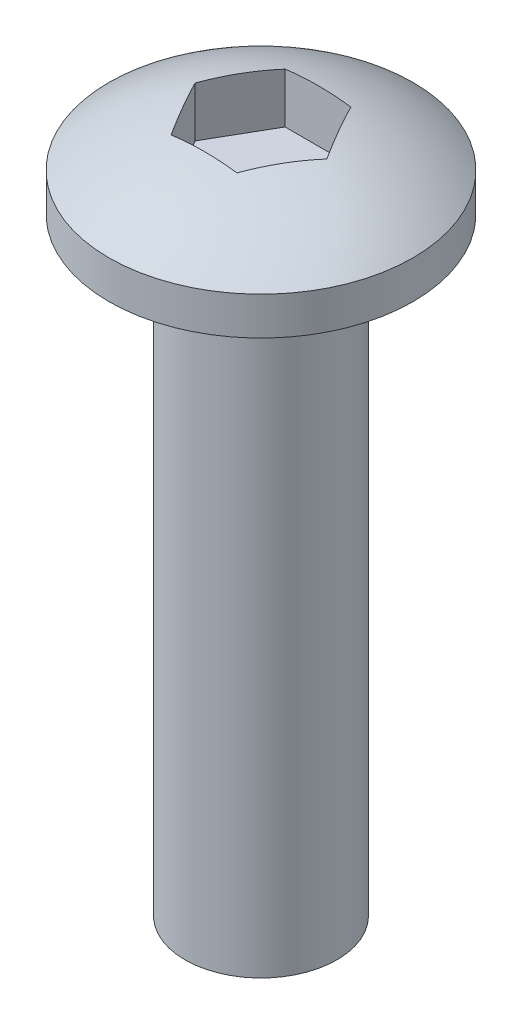
ISO-10303-21;
HEADER;
FILE_DESCRIPTION(('STEP AP214'),'2;1');
FILE_NAME('part.step','',(''),(''),'','','');
FILE_SCHEMA(('AUTOMOTIVE_DESIGN { 1 0 10303 214 1 1 1 1 }'));
ENDSEC;
DATA;
#1=APPLICATION_CONTEXT('core data for automotive mechanical design processes');
#2=APPLICATION_PROTOCOL_DEFINITION('international standard','automotive_design',2000,#1);
#3=PRODUCT_CONTEXT('',#1,'mechanical');
#4=PRODUCT('Part','Part','',(#3));
#5=PRODUCT_RELATED_PRODUCT_CATEGORY('part','',(#4));
#6=PRODUCT_DEFINITION_FORMATION('','',#4);
#7=PRODUCT_DEFINITION_CONTEXT('part definition',#1,'design');
#8=PRODUCT_DEFINITION('design','',#6,#7);
#9=PRODUCT_DEFINITION_SHAPE('','',#8);
#10=(LENGTH_UNIT() NAMED_UNIT(*) SI_UNIT(.MILLI.,.METRE.));
#11=(NAMED_UNIT(*) PLANE_ANGLE_UNIT() SI_UNIT($,.RADIAN.));
#12=(NAMED_UNIT(*) SI_UNIT($,.STERADIAN.) SOLID_ANGLE_UNIT());
#13=UNCERTAINTY_MEASURE_WITH_UNIT(LENGTH_MEASURE(1.E-05),#10,'distance_accuracy_value','');
#14=(GEOMETRIC_REPRESENTATION_CONTEXT(3) GLOBAL_UNCERTAINTY_ASSIGNED_CONTEXT((#13)) GLOBAL_UNIT_ASSIGNED_CONTEXT((#10,
#11,#12)) REPRESENTATION_CONTEXT('',''));
#15=CARTESIAN_POINT('',(0.,0.,0.));
#16=DIRECTION('',(0.,0.,1.));
#17=DIRECTION('',(1.,0.,0.));
#18=AXIS2_PLACEMENT_3D('',#15,#16,#17);
#19=CARTESIAN_POINT('',(0.,8.,0.));
#20=DIRECTION('',(0.,-1.,0.));
#21=DIRECTION('',(0.,0.,-1.));
#22=AXIS2_PLACEMENT_3D('',#19,#20,#21);
#23=CYLINDRICAL_SURFACE('',#22,1.);
#24=CARTESIAN_POINT('',(0.,8.,0.));
#25=DIRECTION('',(0.,1.,0.));
#26=DIRECTION('',(0.,0.,1.));
#27=AXIS2_PLACEMENT_3D('',#24,#25,#26);
#28=CIRCLE('',#27,1.);
#29=CARTESIAN_POINT('',(0.,8.,1.));
#30=VERTEX_POINT('',#29);
#31=EDGE_CURVE('E156',#30,#30,#28,.T.);
#32=ORIENTED_EDGE('',*,*,#31,.F.);
#33=EDGE_LOOP('',(#32));
#34=FACE_BOUND('',#33,.T.);
#35=CARTESIAN_POINT('',(0.,0.,0.));
#36=DIRECTION('',(0.,1.,0.));
#37=DIRECTION('',(0.,0.,1.));
#38=AXIS2_PLACEMENT_3D('',#35,#36,#37);
#39=CIRCLE('',#38,1.);
#40=CARTESIAN_POINT('',(0.,0.,1.));
#41=VERTEX_POINT('',#40);
#42=EDGE_CURVE('E155',#41,#41,#39,.T.);
#43=ORIENTED_EDGE('',*,*,#42,.T.);
#44=EDGE_LOOP('',(#43));
#45=FACE_BOUND('',#44,.T.);
#46=ADVANCED_FACE('F43',(#34,#45),#23,.T.);
#47=CARTESIAN_POINT('',(0.,0.,0.));
#48=DIRECTION('',(0.,1.,0.));
#49=DIRECTION('',(0.,0.,1.));
#50=AXIS2_PLACEMENT_3D('',#47,#48,#49);
#51=PLANE('',#50);
#52=ORIENTED_EDGE('',*,*,#42,.F.);
#53=EDGE_LOOP('',(#52));
#54=FACE_BOUND('',#53,.T.);
#55=ADVANCED_FACE('F201',(#54),#51,.F.);
#56=CARTESIAN_POINT('',(0.,8.,0.));
#57=DIRECTION('',(0.,-1.,0.));
#58=DIRECTION('',(0.,0.,-1.));
#59=AXIS2_PLACEMENT_3D('',#56,#57,#58);
#60=PLANE('',#59);
#61=ORIENTED_EDGE('',*,*,#31,.T.);
#62=EDGE_LOOP('',(#61));
#63=FACE_BOUND('',#62,.T.);
#64=CARTESIAN_POINT('',(0.,8.,0.));
#65=DIRECTION('',(0.,-1.,0.));
#66=DIRECTION('',(0.,0.,-1.));
#67=AXIS2_PLACEMENT_3D('',#64,#65,#66);
#68=CIRCLE('',#67,2.);
#69=CARTESIAN_POINT('',(0.,8.,-2.));
#70=VERTEX_POINT('',#69);
#71=EDGE_CURVE('E134',#70,#70,#68,.T.);
#72=ORIENTED_EDGE('',*,*,#71,.T.);
#73=EDGE_LOOP('',(#72));
#74=FACE_BOUND('',#73,.T.);
#75=ADVANCED_FACE('F206',(#63,#74),#60,.T.);
#76=CARTESIAN_POINT('',(0.,5.87511905031866,0.));
#77=DIRECTION('',(0.,-1.,0.));
#78=DIRECTION('',(1.,0.,0.));
#79=AXIS2_PLACEMENT_3D('',#76,#77,#78);
#80=SPHERICAL_SURFACE('',#79,3.3);
#81=CARTESIAN_POINT('',(0.649519052838329,5.87511905031866,0.375));
#82=DIRECTION('',(0.866025403784439,0.,0.5));
#83=DIRECTION('',(0.5,0.,-0.866025403784439));
#84=AXIS2_PLACEMENT_3D('',#81,#82,#83);
#85=CIRCLE('',#84,3.21364279284428);
#86=CARTESIAN_POINT('',(0.866025403784439,9.0594557159368,0.));
#87=VERTEX_POINT('',#86);
#88=CARTESIAN_POINT('',(0.433012701892219,9.0594557159368,0.750000000000001));
#89=VERTEX_POINT('',#88);
#90=EDGE_CURVE('E160',#87,#89,#85,.T.);
#91=ORIENTED_EDGE('',*,*,#90,.T.);
#92=CARTESIAN_POINT('',(0.,5.87511905031866,0.750000000000001));
#93=DIRECTION('',(0.,0.,1.));
#94=DIRECTION('',(1.,0.,0.));
#95=AXIS2_PLACEMENT_3D('',#92,#93,#94);
#96=CIRCLE('',#95,3.21364279284428);
#97=CARTESIAN_POINT('',(-0.43301270189222,9.05945571593679,0.750000000000001));
#98=VERTEX_POINT('',#97);
#99=EDGE_CURVE('E11',#89,#98,#96,.T.);
#100=ORIENTED_EDGE('',*,*,#99,.T.);
#101=CARTESIAN_POINT('',(-0.64951905283833,5.87511905031866,0.375000000000001));
#102=DIRECTION('',(-0.866025403784439,0.,0.5));
#103=DIRECTION('',(0.5,0.,0.866025403784439));
#104=AXIS2_PLACEMENT_3D('',#101,#102,#103);
#105=CIRCLE('',#104,3.21364279284428);
#106=CARTESIAN_POINT('',(-0.86602540378444,9.05945571593679,0.));
#107=VERTEX_POINT('',#106);
#108=EDGE_CURVE('E51',#98,#107,#105,.T.);
#109=ORIENTED_EDGE('',*,*,#108,.T.);
#110=CARTESIAN_POINT('',(-0.64951905283833,5.87511905031866,-0.375));
#111=DIRECTION('',(-0.866025403784439,0.,-0.5));
#112=DIRECTION('',(-0.5,0.,0.866025403784439));
#113=AXIS2_PLACEMENT_3D('',#110,#111,#112);
#114=CIRCLE('',#113,3.21364279284428);
#115=CARTESIAN_POINT('',(-0.43301270189222,9.05945571593679,-0.750000000000002));
#116=VERTEX_POINT('',#115);
#117=EDGE_CURVE('E174',#107,#116,#114,.T.);
#118=ORIENTED_EDGE('',*,*,#117,.T.);
#119=CARTESIAN_POINT('',(0.,5.87511905031866,-0.750000000000002));
#120=DIRECTION('',(0.,0.,-1.));
#121=DIRECTION('',(-1.,0.,0.));
#122=AXIS2_PLACEMENT_3D('',#119,#120,#121);
#123=CIRCLE('',#122,3.21364279284428);
#124=CARTESIAN_POINT('',(0.433012701892218,9.0594557159368,-0.750000000000002));
#125=VERTEX_POINT('',#124);
#126=EDGE_CURVE('E170',#116,#125,#123,.T.);
#127=ORIENTED_EDGE('',*,*,#126,.T.);
#128=CARTESIAN_POINT('',(0.649519052838329,5.87511905031866,-0.375));
#129=DIRECTION('',(0.866025403784438,0.,-0.5));
#130=DIRECTION('',(-0.5,0.,-0.866025403784439));
#131=AXIS2_PLACEMENT_3D('',#128,#129,#130);
#132=CIRCLE('',#131,3.21364279284428);
#133=EDGE_CURVE('E166',#125,#87,#132,.T.);
#134=ORIENTED_EDGE('',*,*,#133,.T.);
#135=EDGE_LOOP('',(#91,#100,#109,#118,#127,#134));
#136=FACE_BOUND('',#135,.T.);
#137=CARTESIAN_POINT('',(0.,8.5,0.));
#138=DIRECTION('',(0.,-1.,0.));
#139=DIRECTION('',(0.,0.,-1.));
#140=AXIS2_PLACEMENT_3D('',#137,#138,#139);
#141=CIRCLE('',#140,2.);
#142=CARTESIAN_POINT('',(0.,8.5,-2.));
#143=VERTEX_POINT('',#142);
#144=EDGE_CURVE('E151',#143,#143,#141,.T.);
#145=ORIENTED_EDGE('',*,*,#144,.F.);
#146=EDGE_LOOP('',(#145));
#147=FACE_BOUND('',#146,.T.);
#148=ADVANCED_FACE('F179',(#136,#147),#80,.T.);
#149=CARTESIAN_POINT('',(0.,8.,0.));
#150=DIRECTION('',(0.,-1.,0.));
#151=DIRECTION('',(0.,0.,-1.));
#152=AXIS2_PLACEMENT_3D('',#149,#150,#151);
#153=CYLINDRICAL_SURFACE('',#152,2.);
#154=ORIENTED_EDGE('',*,*,#144,.T.);
#155=EDGE_LOOP('',(#154));
#156=FACE_BOUND('',#155,.T.);
#157=ORIENTED_EDGE('',*,*,#71,.F.);
#158=EDGE_LOOP('',(#157));
#159=FACE_BOUND('',#158,.T.);
#160=ADVANCED_FACE('F197',(#156,#159),#153,.T.);
#161=CARTESIAN_POINT('',(-0.43301270189222,8.4,0.750000000000001));
#162=DIRECTION('',(0.,0.,1.));
#163=DIRECTION('',(1.,0.,0.));
#164=AXIS2_PLACEMENT_3D('',#161,#162,#163);
#165=PLANE('',#164);
#166=DIRECTION('',(0.,1.,0.));
#167=VECTOR('',#166,1.);
#168=CARTESIAN_POINT('',(0.433012701892219,8.4,0.750000000000001));
#169=LINE('',#168,#167);
#170=CARTESIAN_POINT('',(0.433012701892219,8.4,0.750000000000001));
#171=VERTEX_POINT('',#170);
#172=EDGE_CURVE('E58',#171,#89,#169,.T.);
#173=ORIENTED_EDGE('',*,*,#172,.F.);
#174=DIRECTION('',(1.,0.,0.));
#175=VECTOR('',#174,1.);
#176=CARTESIAN_POINT('',(-0.43301270189222,8.4,0.750000000000001));
#177=LINE('',#176,#175);
#178=CARTESIAN_POINT('',(-0.43301270189222,8.4,0.750000000000001));
#179=VERTEX_POINT('',#178);
#180=EDGE_CURVE('E97',#179,#171,#177,.T.);
#181=ORIENTED_EDGE('',*,*,#180,.F.);
#182=DIRECTION('',(0.,1.,0.));
#183=VECTOR('',#182,1.);
#184=CARTESIAN_POINT('',(-0.43301270189222,8.4,0.750000000000001));
#185=LINE('',#184,#183);
#186=EDGE_CURVE('E131',#179,#98,#185,.T.);
#187=ORIENTED_EDGE('',*,*,#186,.T.);
#188=ORIENTED_EDGE('',*,*,#99,.F.);
#189=EDGE_LOOP('',(#173,#181,#187,#188));
#190=FACE_BOUND('',#189,.T.);
#191=ADVANCED_FACE('F95',(#190),#165,.F.);
#192=CARTESIAN_POINT('',(-0.86602540378444,8.4,0.));
#193=DIRECTION('',(-0.866025403784439,0.,0.5));
#194=DIRECTION('',(0.5,0.,0.866025403784439));
#195=AXIS2_PLACEMENT_3D('',#192,#193,#194);
#196=PLANE('',#195);
#197=ORIENTED_EDGE('',*,*,#186,.F.);
#198=DIRECTION('',(0.5,0.,0.866025403784439));
#199=VECTOR('',#198,1.);
#200=CARTESIAN_POINT('',(-0.86602540378444,8.4,0.));
#201=LINE('',#200,#199);
#202=CARTESIAN_POINT('',(-0.86602540378444,8.4,0.));
#203=VERTEX_POINT('',#202);
#204=EDGE_CURVE('E102',#203,#179,#201,.T.);
#205=ORIENTED_EDGE('',*,*,#204,.F.);
#206=DIRECTION('',(0.,1.,0.));
#207=VECTOR('',#206,1.);
#208=CARTESIAN_POINT('',(-0.86602540378444,8.4,0.));
#209=LINE('',#208,#207);
#210=EDGE_CURVE('E135',#203,#107,#209,.T.);
#211=ORIENTED_EDGE('',*,*,#210,.T.);
#212=ORIENTED_EDGE('',*,*,#108,.F.);
#213=EDGE_LOOP('',(#197,#205,#211,#212));
#214=FACE_BOUND('',#213,.T.);
#215=ADVANCED_FACE('F189',(#214),#196,.F.);
#216=CARTESIAN_POINT('',(-0.43301270189222,8.4,-0.750000000000002));
#217=DIRECTION('',(-0.866025403784439,0.,-0.5));
#218=DIRECTION('',(-0.5,0.,0.866025403784439));
#219=AXIS2_PLACEMENT_3D('',#216,#217,#218);
#220=PLANE('',#219);
#221=ORIENTED_EDGE('',*,*,#210,.F.);
#222=DIRECTION('',(-0.5,0.,0.866025403784439));
#223=VECTOR('',#222,1.);
#224=CARTESIAN_POINT('',(-0.43301270189222,8.4,-0.750000000000002));
#225=LINE('',#224,#223);
#226=CARTESIAN_POINT('',(-0.43301270189222,8.4,-0.750000000000002));
#227=VERTEX_POINT('',#226);
#228=EDGE_CURVE('E126',#227,#203,#225,.T.);
#229=ORIENTED_EDGE('',*,*,#228,.F.);
#230=DIRECTION('',(0.,1.,0.));
#231=VECTOR('',#230,1.);
#232=CARTESIAN_POINT('',(-0.43301270189222,8.4,-0.750000000000002));
#233=LINE('',#232,#231);
#234=EDGE_CURVE('E138',#227,#116,#233,.T.);
#235=ORIENTED_EDGE('',*,*,#234,.T.);
#236=ORIENTED_EDGE('',*,*,#117,.F.);
#237=EDGE_LOOP('',(#221,#229,#235,#236));
#238=FACE_BOUND('',#237,.T.);
#239=ADVANCED_FACE('F188',(#238),#220,.F.);
#240=CARTESIAN_POINT('',(0.433012701892218,8.4,-0.750000000000002));
#241=DIRECTION('',(0.,0.,-1.));
#242=DIRECTION('',(-1.,0.,0.));
#243=AXIS2_PLACEMENT_3D('',#240,#241,#242);
#244=PLANE('',#243);
#245=ORIENTED_EDGE('',*,*,#234,.F.);
#246=DIRECTION('',(-1.,0.,0.));
#247=VECTOR('',#246,1.);
#248=CARTESIAN_POINT('',(0.433012701892218,8.4,-0.750000000000002));
#249=LINE('',#248,#247);
#250=CARTESIAN_POINT('',(0.433012701892218,8.4,-0.750000000000002));
#251=VERTEX_POINT('',#250);
#252=EDGE_CURVE('E122',#251,#227,#249,.T.);
#253=ORIENTED_EDGE('',*,*,#252,.F.);
#254=DIRECTION('',(0.,1.,0.));
#255=VECTOR('',#254,1.);
#256=CARTESIAN_POINT('',(0.433012701892218,8.4,-0.750000000000002));
#257=LINE('',#256,#255);
#258=EDGE_CURVE('E142',#251,#125,#257,.T.);
#259=ORIENTED_EDGE('',*,*,#258,.T.);
#260=ORIENTED_EDGE('',*,*,#126,.F.);
#261=EDGE_LOOP('',(#245,#253,#259,#260));
#262=FACE_BOUND('',#261,.T.);
#263=ADVANCED_FACE('F186',(#262),#244,.F.);
#264=CARTESIAN_POINT('',(0.866025403784439,8.4,0.));
#265=DIRECTION('',(0.866025403784438,0.,-0.5));
#266=DIRECTION('',(-0.5,0.,-0.866025403784439));
#267=AXIS2_PLACEMENT_3D('',#264,#265,#266);
#268=PLANE('',#267);
#269=ORIENTED_EDGE('',*,*,#258,.F.);
#270=DIRECTION('',(-0.5,0.,-0.866025403784439));
#271=VECTOR('',#270,1.);
#272=CARTESIAN_POINT('',(0.866025403784439,8.4,0.));
#273=LINE('',#272,#271);
#274=CARTESIAN_POINT('',(0.866025403784439,8.4,0.));
#275=VERTEX_POINT('',#274);
#276=EDGE_CURVE('E112',#275,#251,#273,.T.);
#277=ORIENTED_EDGE('',*,*,#276,.F.);
#278=DIRECTION('',(0.,1.,0.));
#279=VECTOR('',#278,1.);
#280=CARTESIAN_POINT('',(0.866025403784439,8.4,0.));
#281=LINE('',#280,#279);
#282=EDGE_CURVE('E101',#275,#87,#281,.T.);
#283=ORIENTED_EDGE('',*,*,#282,.T.);
#284=ORIENTED_EDGE('',*,*,#133,.F.);
#285=EDGE_LOOP('',(#269,#277,#283,#284));
#286=FACE_BOUND('',#285,.T.);
#287=ADVANCED_FACE('F182',(#286),#268,.F.);
#288=CARTESIAN_POINT('',(0.433012701892219,8.4,0.750000000000001));
#289=DIRECTION('',(0.866025403784439,0.,0.5));
#290=DIRECTION('',(0.5,0.,-0.866025403784439));
#291=AXIS2_PLACEMENT_3D('',#288,#289,#290);
#292=PLANE('',#291);
#293=ORIENTED_EDGE('',*,*,#282,.F.);
#294=DIRECTION('',(0.5,0.,-0.866025403784439));
#295=VECTOR('',#294,1.);
#296=CARTESIAN_POINT('',(0.433012701892219,8.4,0.750000000000001));
#297=LINE('',#296,#295);
#298=EDGE_CURVE('E105',#171,#275,#297,.T.);
#299=ORIENTED_EDGE('',*,*,#298,.F.);
#300=ORIENTED_EDGE('',*,*,#172,.T.);
#301=ORIENTED_EDGE('',*,*,#90,.F.);
#302=EDGE_LOOP('',(#293,#299,#300,#301));
#303=FACE_BOUND('',#302,.T.);
#304=ADVANCED_FACE('F106',(#303),#292,.F.);
#305=CARTESIAN_POINT('',(0.,8.4,0.));
#306=DIRECTION('',(0.,1.,0.));
#307=DIRECTION('',(0.,0.,1.));
#308=AXIS2_PLACEMENT_3D('',#305,#306,#307);
#309=PLANE('',#308);
#310=ORIENTED_EDGE('',*,*,#180,.T.);
#311=ORIENTED_EDGE('',*,*,#298,.T.);
#312=ORIENTED_EDGE('',*,*,#276,.T.);
#313=ORIENTED_EDGE('',*,*,#252,.T.);
#314=ORIENTED_EDGE('',*,*,#228,.T.);
#315=ORIENTED_EDGE('',*,*,#204,.T.);
#316=EDGE_LOOP('',(#310,#311,#312,#313,#314,#315));
#317=FACE_BOUND('',#316,.T.);
#318=ADVANCED_FACE('F114',(#317),#309,.T.);
#319=CLOSED_SHELL('',(#46,#55,#75,#148,#160,#191,#215,#239,#263,#287,#304,#318));
#320=MANIFOLD_SOLID_BREP('B2',#319);
#321=ADVANCED_BREP_SHAPE_REPRESENTATION('',(#18,#320),#14);
#322=SHAPE_DEFINITION_REPRESENTATION(#9,#321);
ENDSEC;
END-ISO-10303-21;
